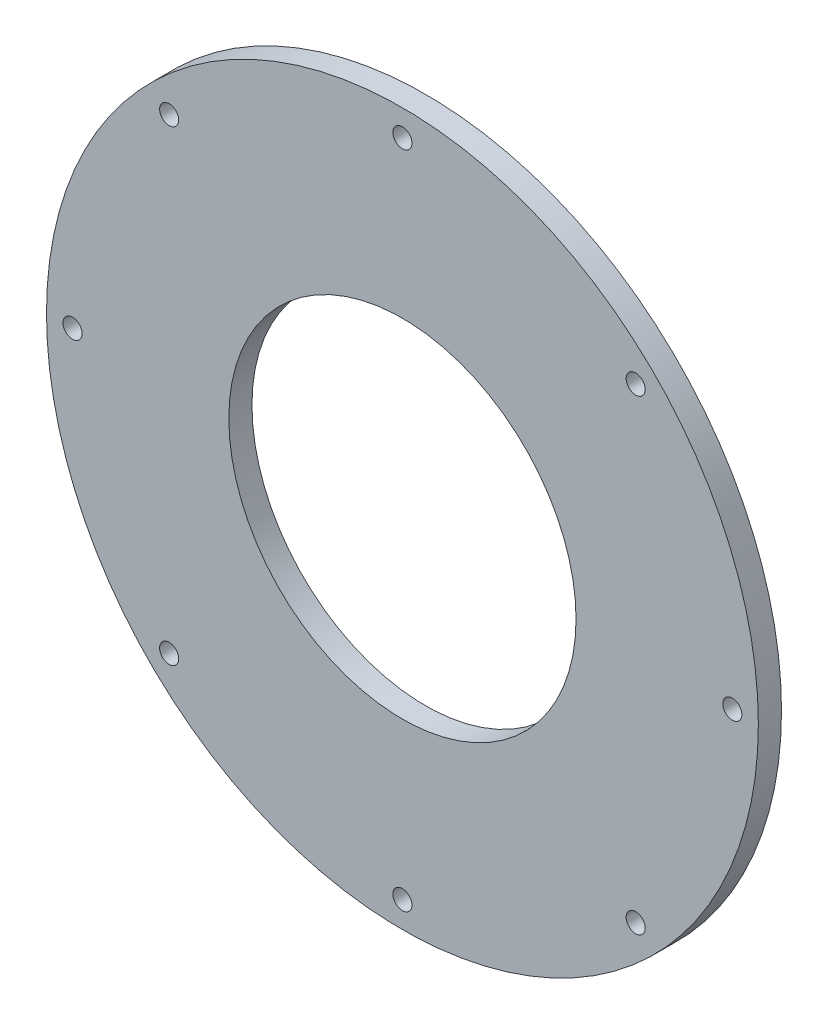
ISO-10303-21;
HEADER;
FILE_DESCRIPTION(('STEP AP214'),'2;1');
FILE_NAME('part.step','',(''),(''),'','','');
FILE_SCHEMA(('AUTOMOTIVE_DESIGN { 1 0 10303 214 1 1 1 1 }'));
ENDSEC;
DATA;
#1=APPLICATION_CONTEXT('core data for automotive mechanical design processes');
#2=APPLICATION_PROTOCOL_DEFINITION('international standard','automotive_design',2000,#1);
#3=PRODUCT_CONTEXT('',#1,'mechanical');
#4=PRODUCT('Part','Part','',(#3));
#5=PRODUCT_RELATED_PRODUCT_CATEGORY('part','',(#4));
#6=PRODUCT_DEFINITION_FORMATION('','',#4);
#7=PRODUCT_DEFINITION_CONTEXT('part definition',#1,'design');
#8=PRODUCT_DEFINITION('design','',#6,#7);
#9=PRODUCT_DEFINITION_SHAPE('','',#8);
#10=(LENGTH_UNIT() NAMED_UNIT(*) SI_UNIT(.MILLI.,.METRE.));
#11=(NAMED_UNIT(*) PLANE_ANGLE_UNIT() SI_UNIT($,.RADIAN.));
#12=(NAMED_UNIT(*) SI_UNIT($,.STERADIAN.) SOLID_ANGLE_UNIT());
#13=UNCERTAINTY_MEASURE_WITH_UNIT(LENGTH_MEASURE(1.E-05),#10,'distance_accuracy_value','');
#14=(GEOMETRIC_REPRESENTATION_CONTEXT(3) GLOBAL_UNCERTAINTY_ASSIGNED_CONTEXT((#13)) GLOBAL_UNIT_ASSIGNED_CONTEXT((#10,
#11,#12)) REPRESENTATION_CONTEXT('',''));
#15=CARTESIAN_POINT('',(0.,0.,0.));
#16=DIRECTION('',(0.,0.,1.));
#17=DIRECTION('',(1.,0.,0.));
#18=AXIS2_PLACEMENT_3D('',#15,#16,#17);
#19=CARTESIAN_POINT('',(0.,0.,4.));
#20=DIRECTION('',(0.,0.,1.));
#21=DIRECTION('',(1.,0.,0.));
#22=AXIS2_PLACEMENT_3D('',#19,#20,#21);
#23=PLANE('',#22);
#24=CARTESIAN_POINT('',(0.,0.,4.));
#25=DIRECTION('',(0.,0.,1.));
#26=DIRECTION('',(1.,0.,0.));
#27=AXIS2_PLACEMENT_3D('',#24,#25,#26);
#28=CIRCLE('',#27,30.);
#29=CARTESIAN_POINT('',(30.,0.,4.));
#30=VERTEX_POINT('',#29);
#31=EDGE_CURVE('E117',#30,#30,#28,.T.);
#32=ORIENTED_EDGE('',*,*,#31,.F.);
#33=EDGE_LOOP('',(#32));
#34=FACE_BOUND('',#33,.T.);
#35=CARTESIAN_POINT('',(57.,-5.96492217882559E-13,4.));
#36=DIRECTION('',(0.,0.,1.));
#37=DIRECTION('',(1.,0.,0.));
#38=AXIS2_PLACEMENT_3D('',#35,#36,#37);
#39=CIRCLE('',#38,1.65);
#40=CARTESIAN_POINT('',(58.65,-5.96492217882559E-13,4.));
#41=VERTEX_POINT('',#40);
#42=EDGE_CURVE('E98',#41,#41,#39,.T.);
#43=ORIENTED_EDGE('',*,*,#42,.F.);
#44=EDGE_LOOP('',(#43));
#45=FACE_BOUND('',#44,.T.);
#46=CARTESIAN_POINT('',(3.97477781568501E-13,57.,4.));
#47=DIRECTION('',(0.,0.,1.));
#48=DIRECTION('',(1.,0.,0.));
#49=AXIS2_PLACEMENT_3D('',#46,#47,#48);
#50=CIRCLE('',#49,1.65);
#51=CARTESIAN_POINT('',(1.6500000000004,57.,4.));
#52=VERTEX_POINT('',#51);
#53=EDGE_CURVE('E82',#52,#52,#50,.T.);
#54=ORIENTED_EDGE('',*,*,#53,.F.);
#55=EDGE_LOOP('',(#54));
#56=FACE_BOUND('',#55,.T.);
#57=CARTESIAN_POINT('',(-57.,1.00835959934104E-12,4.));
#58=DIRECTION('',(0.,0.,1.));
#59=DIRECTION('',(1.,0.,0.));
#60=AXIS2_PLACEMENT_3D('',#57,#58,#59);
#61=CIRCLE('',#60,1.65);
#62=CARTESIAN_POINT('',(-55.35,1.00835959934104E-12,4.));
#63=VERTEX_POINT('',#62);
#64=EDGE_CURVE('E66',#63,#63,#61,.T.);
#65=ORIENTED_EDGE('',*,*,#64,.F.);
#66=EDGE_LOOP('',(#65));
#67=FACE_BOUND('',#66,.T.);
#68=CARTESIAN_POINT('',(0.,-57.,4.));
#69=DIRECTION('',(0.,0.,1.));
#70=DIRECTION('',(1.,0.,0.));
#71=AXIS2_PLACEMENT_3D('',#68,#69,#70);
#72=CIRCLE('',#71,1.65);
#73=CARTESIAN_POINT('',(1.65,-57.,4.));
#74=VERTEX_POINT('',#73);
#75=EDGE_CURVE('E52',#74,#74,#72,.T.);
#76=ORIENTED_EDGE('',*,*,#75,.F.);
#77=EDGE_LOOP('',(#76));
#78=FACE_BOUND('',#77,.T.);
#79=CARTESIAN_POINT('',(0.,0.,4.));
#80=DIRECTION('',(0.,0.,1.));
#81=DIRECTION('',(1.,0.,0.));
#82=AXIS2_PLACEMENT_3D('',#79,#80,#81);
#83=CIRCLE('',#82,61.5);
#84=CARTESIAN_POINT('',(61.5,0.,4.));
#85=VERTEX_POINT('',#84);
#86=EDGE_CURVE('E10',#85,#85,#83,.T.);
#87=ORIENTED_EDGE('',*,*,#86,.T.);
#88=EDGE_LOOP('',(#87));
#89=FACE_BOUND('',#88,.T.);
#90=CARTESIAN_POINT('',(-40.3050865276338,-40.3050865276326,4.));
#91=DIRECTION('',(0.,0.,1.));
#92=DIRECTION('',(1.,0.,0.));
#93=AXIS2_PLACEMENT_3D('',#90,#91,#92);
#94=CIRCLE('',#93,1.65);
#95=CARTESIAN_POINT('',(-38.6550865276338,-40.3050865276326,4.));
#96=VERTEX_POINT('',#95);
#97=EDGE_CURVE('E58',#96,#96,#94,.T.);
#98=ORIENTED_EDGE('',*,*,#97,.F.);
#99=EDGE_LOOP('',(#98));
#100=FACE_BOUND('',#99,.T.);
#101=CARTESIAN_POINT('',(-40.305086527633,40.3050865276334,4.));
#102=DIRECTION('',(0.,0.,1.));
#103=DIRECTION('',(1.,0.,0.));
#104=AXIS2_PLACEMENT_3D('',#101,#102,#103);
#105=CIRCLE('',#104,1.65);
#106=CARTESIAN_POINT('',(-38.655086527633,40.3050865276334,4.));
#107=VERTEX_POINT('',#106);
#108=EDGE_CURVE('E74',#107,#107,#105,.T.);
#109=ORIENTED_EDGE('',*,*,#108,.F.);
#110=EDGE_LOOP('',(#109));
#111=FACE_BOUND('',#110,.T.);
#112=CARTESIAN_POINT('',(40.3050865276336,40.3050865276329,4.));
#113=DIRECTION('',(0.,0.,1.));
#114=DIRECTION('',(1.,0.,0.));
#115=AXIS2_PLACEMENT_3D('',#112,#113,#114);
#116=CIRCLE('',#115,1.65);
#117=CARTESIAN_POINT('',(41.9550865276336,40.3050865276329,4.));
#118=VERTEX_POINT('',#117);
#119=EDGE_CURVE('E90',#118,#118,#116,.T.);
#120=ORIENTED_EDGE('',*,*,#119,.F.);
#121=EDGE_LOOP('',(#120));
#122=FACE_BOUND('',#121,.T.);
#123=CARTESIAN_POINT('',(40.3050865276327,-40.3050865276337,4.));
#124=DIRECTION('',(0.,0.,1.));
#125=DIRECTION('',(1.,0.,0.));
#126=AXIS2_PLACEMENT_3D('',#123,#124,#125);
#127=CIRCLE('',#126,1.65);
#128=CARTESIAN_POINT('',(41.9550865276327,-40.3050865276337,4.));
#129=VERTEX_POINT('',#128);
#130=EDGE_CURVE('E106',#129,#129,#127,.T.);
#131=ORIENTED_EDGE('',*,*,#130,.F.);
#132=EDGE_LOOP('',(#131));
#133=FACE_BOUND('',#132,.T.);
#134=ADVANCED_FACE('F37',(#34,#45,#56,#67,#78,#89,#100,#111,#122,#133),#23,.T.);
#135=CARTESIAN_POINT('',(0.,0.,0.));
#136=DIRECTION('',(0.,0.,1.));
#137=DIRECTION('',(1.,0.,0.));
#138=AXIS2_PLACEMENT_3D('',#135,#136,#137);
#139=PLANE('',#138);
#140=CARTESIAN_POINT('',(0.,0.,0.));
#141=DIRECTION('',(0.,0.,1.));
#142=DIRECTION('',(1.,0.,0.));
#143=AXIS2_PLACEMENT_3D('',#140,#141,#142);
#144=CIRCLE('',#143,30.);
#145=CARTESIAN_POINT('',(30.,0.,0.));
#146=VERTEX_POINT('',#145);
#147=EDGE_CURVE('E41',#146,#146,#144,.T.);
#148=ORIENTED_EDGE('',*,*,#147,.T.);
#149=EDGE_LOOP('',(#148));
#150=FACE_BOUND('',#149,.T.);
#151=CARTESIAN_POINT('',(0.,0.,0.));
#152=DIRECTION('',(0.,0.,1.));
#153=DIRECTION('',(1.,0.,0.));
#154=AXIS2_PLACEMENT_3D('',#151,#152,#153);
#155=CIRCLE('',#154,61.5);
#156=CARTESIAN_POINT('',(61.5,0.,0.));
#157=VERTEX_POINT('',#156);
#158=EDGE_CURVE('E46',#157,#157,#155,.T.);
#159=ORIENTED_EDGE('',*,*,#158,.F.);
#160=EDGE_LOOP('',(#159));
#161=FACE_BOUND('',#160,.T.);
#162=CARTESIAN_POINT('',(0.,-57.,0.));
#163=DIRECTION('',(0.,0.,1.));
#164=DIRECTION('',(1.,0.,0.));
#165=AXIS2_PLACEMENT_3D('',#162,#163,#164);
#166=CIRCLE('',#165,1.65);
#167=CARTESIAN_POINT('',(1.65,-57.,0.));
#168=VERTEX_POINT('',#167);
#169=EDGE_CURVE('E54',#168,#168,#166,.T.);
#170=ORIENTED_EDGE('',*,*,#169,.T.);
#171=EDGE_LOOP('',(#170));
#172=FACE_BOUND('',#171,.T.);
#173=CARTESIAN_POINT('',(-40.3050865276338,-40.3050865276326,0.));
#174=DIRECTION('',(0.,0.,1.));
#175=DIRECTION('',(1.,0.,0.));
#176=AXIS2_PLACEMENT_3D('',#173,#174,#175);
#177=CIRCLE('',#176,1.65);
#178=CARTESIAN_POINT('',(-38.6550865276338,-40.3050865276326,0.));
#179=VERTEX_POINT('',#178);
#180=EDGE_CURVE('E62',#179,#179,#177,.T.);
#181=ORIENTED_EDGE('',*,*,#180,.T.);
#182=EDGE_LOOP('',(#181));
#183=FACE_BOUND('',#182,.T.);
#184=CARTESIAN_POINT('',(-57.,1.00835959934104E-12,0.));
#185=DIRECTION('',(0.,0.,1.));
#186=DIRECTION('',(1.,0.,0.));
#187=AXIS2_PLACEMENT_3D('',#184,#185,#186);
#188=CIRCLE('',#187,1.65);
#189=CARTESIAN_POINT('',(-55.35,1.00835959934104E-12,0.));
#190=VERTEX_POINT('',#189);
#191=EDGE_CURVE('E70',#190,#190,#188,.T.);
#192=ORIENTED_EDGE('',*,*,#191,.T.);
#193=EDGE_LOOP('',(#192));
#194=FACE_BOUND('',#193,.T.);
#195=CARTESIAN_POINT('',(-40.305086527633,40.3050865276334,0.));
#196=DIRECTION('',(0.,0.,1.));
#197=DIRECTION('',(1.,0.,0.));
#198=AXIS2_PLACEMENT_3D('',#195,#196,#197);
#199=CIRCLE('',#198,1.65);
#200=CARTESIAN_POINT('',(-38.655086527633,40.3050865276334,0.));
#201=VERTEX_POINT('',#200);
#202=EDGE_CURVE('E78',#201,#201,#199,.T.);
#203=ORIENTED_EDGE('',*,*,#202,.T.);
#204=EDGE_LOOP('',(#203));
#205=FACE_BOUND('',#204,.T.);
#206=CARTESIAN_POINT('',(3.97477781568501E-13,57.,0.));
#207=DIRECTION('',(0.,0.,1.));
#208=DIRECTION('',(1.,0.,0.));
#209=AXIS2_PLACEMENT_3D('',#206,#207,#208);
#210=CIRCLE('',#209,1.65);
#211=CARTESIAN_POINT('',(1.6500000000004,57.,0.));
#212=VERTEX_POINT('',#211);
#213=EDGE_CURVE('E86',#212,#212,#210,.T.);
#214=ORIENTED_EDGE('',*,*,#213,.T.);
#215=EDGE_LOOP('',(#214));
#216=FACE_BOUND('',#215,.T.);
#217=CARTESIAN_POINT('',(40.3050865276336,40.3050865276329,0.));
#218=DIRECTION('',(0.,0.,1.));
#219=DIRECTION('',(1.,0.,0.));
#220=AXIS2_PLACEMENT_3D('',#217,#218,#219);
#221=CIRCLE('',#220,1.65);
#222=CARTESIAN_POINT('',(41.9550865276336,40.3050865276329,0.));
#223=VERTEX_POINT('',#222);
#224=EDGE_CURVE('E94',#223,#223,#221,.T.);
#225=ORIENTED_EDGE('',*,*,#224,.T.);
#226=EDGE_LOOP('',(#225));
#227=FACE_BOUND('',#226,.T.);
#228=CARTESIAN_POINT('',(57.,-5.96492217882559E-13,0.));
#229=DIRECTION('',(0.,0.,1.));
#230=DIRECTION('',(1.,0.,0.));
#231=AXIS2_PLACEMENT_3D('',#228,#229,#230);
#232=CIRCLE('',#231,1.65);
#233=CARTESIAN_POINT('',(58.65,-5.96492217882559E-13,0.));
#234=VERTEX_POINT('',#233);
#235=EDGE_CURVE('E102',#234,#234,#232,.T.);
#236=ORIENTED_EDGE('',*,*,#235,.T.);
#237=EDGE_LOOP('',(#236));
#238=FACE_BOUND('',#237,.T.);
#239=CARTESIAN_POINT('',(40.3050865276327,-40.3050865276337,0.));
#240=DIRECTION('',(0.,0.,1.));
#241=DIRECTION('',(1.,0.,0.));
#242=AXIS2_PLACEMENT_3D('',#239,#240,#241);
#243=CIRCLE('',#242,1.65);
#244=CARTESIAN_POINT('',(41.9550865276327,-40.3050865276337,0.));
#245=VERTEX_POINT('',#244);
#246=EDGE_CURVE('E110',#245,#245,#243,.T.);
#247=ORIENTED_EDGE('',*,*,#246,.T.);
#248=EDGE_LOOP('',(#247));
#249=FACE_BOUND('',#248,.T.);
#250=ADVANCED_FACE('F126',(#150,#161,#172,#183,#194,#205,#216,#227,#238,#249),#139,.F.);
#251=CARTESIAN_POINT('',(0.,0.,4.));
#252=DIRECTION('',(0.,0.,-1.));
#253=DIRECTION('',(-1.,0.,0.));
#254=AXIS2_PLACEMENT_3D('',#251,#252,#253);
#255=CYLINDRICAL_SURFACE('',#254,61.5);
#256=ORIENTED_EDGE('',*,*,#86,.F.);
#257=EDGE_LOOP('',(#256));
#258=FACE_BOUND('',#257,.T.);
#259=ORIENTED_EDGE('',*,*,#158,.T.);
#260=EDGE_LOOP('',(#259));
#261=FACE_BOUND('',#260,.T.);
#262=ADVANCED_FACE('F39',(#258,#261),#255,.T.);
#263=CARTESIAN_POINT('',(0.,-57.,4.));
#264=DIRECTION('',(0.,0.,-1.));
#265=DIRECTION('',(-1.,0.,0.));
#266=AXIS2_PLACEMENT_3D('',#263,#264,#265);
#267=CYLINDRICAL_SURFACE('',#266,1.65);
#268=ORIENTED_EDGE('',*,*,#75,.T.);
#269=EDGE_LOOP('',(#268));
#270=FACE_BOUND('',#269,.T.);
#271=ORIENTED_EDGE('',*,*,#169,.F.);
#272=EDGE_LOOP('',(#271));
#273=FACE_BOUND('',#272,.T.);
#274=ADVANCED_FACE('F147',(#270,#273),#267,.F.);
#275=CARTESIAN_POINT('',(-40.3050865276338,-40.3050865276326,4.));
#276=DIRECTION('',(0.,0.,-1.));
#277=DIRECTION('',(-1.,0.,0.));
#278=AXIS2_PLACEMENT_3D('',#275,#276,#277);
#279=CYLINDRICAL_SURFACE('',#278,1.65);
#280=ORIENTED_EDGE('',*,*,#97,.T.);
#281=EDGE_LOOP('',(#280));
#282=FACE_BOUND('',#281,.T.);
#283=ORIENTED_EDGE('',*,*,#180,.F.);
#284=EDGE_LOOP('',(#283));
#285=FACE_BOUND('',#284,.T.);
#286=ADVANCED_FACE('F150',(#282,#285),#279,.F.);
#287=CARTESIAN_POINT('',(-57.,1.00835959934104E-12,4.));
#288=DIRECTION('',(0.,0.,-1.));
#289=DIRECTION('',(-1.,0.,0.));
#290=AXIS2_PLACEMENT_3D('',#287,#288,#289);
#291=CYLINDRICAL_SURFACE('',#290,1.65);
#292=ORIENTED_EDGE('',*,*,#64,.T.);
#293=EDGE_LOOP('',(#292));
#294=FACE_BOUND('',#293,.T.);
#295=ORIENTED_EDGE('',*,*,#191,.F.);
#296=EDGE_LOOP('',(#295));
#297=FACE_BOUND('',#296,.T.);
#298=ADVANCED_FACE('F154',(#294,#297),#291,.F.);
#299=CARTESIAN_POINT('',(-40.305086527633,40.3050865276334,4.));
#300=DIRECTION('',(0.,0.,-1.));
#301=DIRECTION('',(-1.,0.,0.));
#302=AXIS2_PLACEMENT_3D('',#299,#300,#301);
#303=CYLINDRICAL_SURFACE('',#302,1.65);
#304=ORIENTED_EDGE('',*,*,#108,.T.);
#305=EDGE_LOOP('',(#304));
#306=FACE_BOUND('',#305,.T.);
#307=ORIENTED_EDGE('',*,*,#202,.F.);
#308=EDGE_LOOP('',(#307));
#309=FACE_BOUND('',#308,.T.);
#310=ADVANCED_FACE('F158',(#306,#309),#303,.F.);
#311=CARTESIAN_POINT('',(3.97477781568501E-13,57.,4.));
#312=DIRECTION('',(0.,0.,-1.));
#313=DIRECTION('',(-1.,0.,0.));
#314=AXIS2_PLACEMENT_3D('',#311,#312,#313);
#315=CYLINDRICAL_SURFACE('',#314,1.65);
#316=ORIENTED_EDGE('',*,*,#53,.T.);
#317=EDGE_LOOP('',(#316));
#318=FACE_BOUND('',#317,.T.);
#319=ORIENTED_EDGE('',*,*,#213,.F.);
#320=EDGE_LOOP('',(#319));
#321=FACE_BOUND('',#320,.T.);
#322=ADVANCED_FACE('F162',(#318,#321),#315,.F.);
#323=CARTESIAN_POINT('',(40.3050865276336,40.3050865276329,4.));
#324=DIRECTION('',(0.,0.,-1.));
#325=DIRECTION('',(-1.,0.,0.));
#326=AXIS2_PLACEMENT_3D('',#323,#324,#325);
#327=CYLINDRICAL_SURFACE('',#326,1.65);
#328=ORIENTED_EDGE('',*,*,#119,.T.);
#329=EDGE_LOOP('',(#328));
#330=FACE_BOUND('',#329,.T.);
#331=ORIENTED_EDGE('',*,*,#224,.F.);
#332=EDGE_LOOP('',(#331));
#333=FACE_BOUND('',#332,.T.);
#334=ADVANCED_FACE('F166',(#330,#333),#327,.F.);
#335=CARTESIAN_POINT('',(57.,-5.96492217882559E-13,4.));
#336=DIRECTION('',(0.,0.,-1.));
#337=DIRECTION('',(-1.,0.,0.));
#338=AXIS2_PLACEMENT_3D('',#335,#336,#337);
#339=CYLINDRICAL_SURFACE('',#338,1.65);
#340=ORIENTED_EDGE('',*,*,#42,.T.);
#341=EDGE_LOOP('',(#340));
#342=FACE_BOUND('',#341,.T.);
#343=ORIENTED_EDGE('',*,*,#235,.F.);
#344=EDGE_LOOP('',(#343));
#345=FACE_BOUND('',#344,.T.);
#346=ADVANCED_FACE('F136',(#342,#345),#339,.F.);
#347=CARTESIAN_POINT('',(40.3050865276327,-40.3050865276337,4.));
#348=DIRECTION('',(0.,0.,-1.));
#349=DIRECTION('',(-1.,0.,0.));
#350=AXIS2_PLACEMENT_3D('',#347,#348,#349);
#351=CYLINDRICAL_SURFACE('',#350,1.65);
#352=ORIENTED_EDGE('',*,*,#130,.T.);
#353=EDGE_LOOP('',(#352));
#354=FACE_BOUND('',#353,.T.);
#355=ORIENTED_EDGE('',*,*,#246,.F.);
#356=EDGE_LOOP('',(#355));
#357=FACE_BOUND('',#356,.T.);
#358=ADVANCED_FACE('F131',(#354,#357),#351,.F.);
#359=CARTESIAN_POINT('',(0.,0.,-6.));
#360=DIRECTION('',(0.,0.,1.));
#361=DIRECTION('',(1.,0.,0.));
#362=AXIS2_PLACEMENT_3D('',#359,#360,#361);
#363=CYLINDRICAL_SURFACE('',#362,30.);
#364=ORIENTED_EDGE('',*,*,#31,.T.);
#365=EDGE_LOOP('',(#364));
#366=FACE_BOUND('',#365,.T.);
#367=ORIENTED_EDGE('',*,*,#147,.F.);
#368=EDGE_LOOP('',(#367));
#369=FACE_BOUND('',#368,.T.);
#370=ADVANCED_FACE('F129',(#366,#369),#363,.F.);
#371=CLOSED_SHELL('',(#134,#250,#262,#274,#286,#298,#310,#322,#334,#346,#358,#370));
#372=MANIFOLD_SOLID_BREP('B2',#371);
#373=ADVANCED_BREP_SHAPE_REPRESENTATION('',(#18,#372),#14);
#374=SHAPE_DEFINITION_REPRESENTATION(#9,#373);
ENDSEC;
END-ISO-10303-21;
